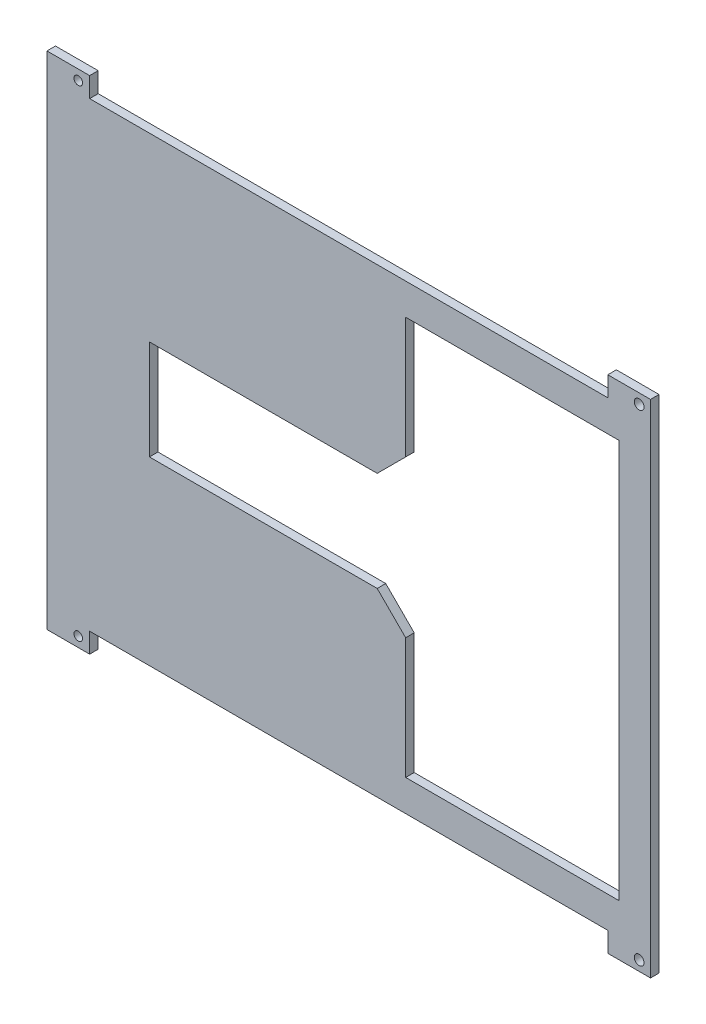
ISO-10303-21;
HEADER;
FILE_DESCRIPTION(('STEP AP214'),'2;1');
FILE_NAME('part.step','',(''),(''),'','','');
FILE_SCHEMA(('AUTOMOTIVE_DESIGN { 1 0 10303 214 1 1 1 1 }'));
ENDSEC;
DATA;
#1=APPLICATION_CONTEXT('core data for automotive mechanical design processes');
#2=APPLICATION_PROTOCOL_DEFINITION('international standard','automotive_design',2000,#1);
#3=PRODUCT_CONTEXT('',#1,'mechanical');
#4=PRODUCT('Part','Part','',(#3));
#5=PRODUCT_RELATED_PRODUCT_CATEGORY('part','',(#4));
#6=PRODUCT_DEFINITION_FORMATION('','',#4);
#7=PRODUCT_DEFINITION_CONTEXT('part definition',#1,'design');
#8=PRODUCT_DEFINITION('design','',#6,#7);
#9=PRODUCT_DEFINITION_SHAPE('','',#8);
#10=(LENGTH_UNIT() NAMED_UNIT(*) SI_UNIT(.MILLI.,.METRE.));
#11=(NAMED_UNIT(*) PLANE_ANGLE_UNIT() SI_UNIT($,.RADIAN.));
#12=(NAMED_UNIT(*) SI_UNIT($,.STERADIAN.) SOLID_ANGLE_UNIT());
#13=UNCERTAINTY_MEASURE_WITH_UNIT(LENGTH_MEASURE(1.E-05),#10,'distance_accuracy_value','');
#14=(GEOMETRIC_REPRESENTATION_CONTEXT(3) GLOBAL_UNCERTAINTY_ASSIGNED_CONTEXT((#13)) GLOBAL_UNIT_ASSIGNED_CONTEXT((#10,
#11,#12)) REPRESENTATION_CONTEXT('',''));
#15=CARTESIAN_POINT('',(0.,0.,0.));
#16=DIRECTION('',(0.,0.,1.));
#17=DIRECTION('',(1.,0.,0.));
#18=AXIS2_PLACEMENT_3D('',#15,#16,#17);
#19=CARTESIAN_POINT('',(0.,151.,3.));
#20=DIRECTION('',(0.,-1.,0.));
#21=DIRECTION('',(0.,0.,-1.));
#22=AXIS2_PLACEMENT_3D('',#19,#20,#21);
#23=PLANE('',#22);
#24=DIRECTION('',(-1.,0.,0.));
#25=VECTOR('',#24,1.);
#26=CARTESIAN_POINT('',(0.,151.,0.));
#27=LINE('',#26,#25);
#28=CARTESIAN_POINT('',(201.,151.,0.));
#29=VERTEX_POINT('',#28);
#30=CARTESIAN_POINT('',(126.,151.,0.));
#31=VERTEX_POINT('',#30);
#32=EDGE_CURVE('E307',#29,#31,#27,.T.);
#33=ORIENTED_EDGE('',*,*,#32,.F.);
#34=DIRECTION('',(0.,0.,-1.));
#35=VECTOR('',#34,1.);
#36=CARTESIAN_POINT('',(201.,151.,3.));
#37=LINE('',#36,#35);
#38=CARTESIAN_POINT('',(201.,151.,3.));
#39=VERTEX_POINT('',#38);
#40=EDGE_CURVE('E348',#39,#29,#37,.T.);
#41=ORIENTED_EDGE('',*,*,#40,.F.);
#42=DIRECTION('',(-1.,0.,0.));
#43=VECTOR('',#42,1.);
#44=CARTESIAN_POINT('',(0.,151.,3.));
#45=LINE('',#44,#43);
#46=CARTESIAN_POINT('',(126.,151.,3.));
#47=VERTEX_POINT('',#46);
#48=EDGE_CURVE('E243',#39,#47,#45,.T.);
#49=ORIENTED_EDGE('',*,*,#48,.T.);
#50=DIRECTION('',(0.,0.,-1.));
#51=VECTOR('',#50,1.);
#52=CARTESIAN_POINT('',(126.,151.,3.));
#53=LINE('',#52,#51);
#54=EDGE_CURVE('E202',#47,#31,#53,.T.);
#55=ORIENTED_EDGE('',*,*,#54,.T.);
#56=EDGE_LOOP('',(#33,#41,#49,#55));
#57=FACE_BOUND('',#56,.T.);
#58=ADVANCED_FACE('F41',(#57),#23,.T.);
#59=CARTESIAN_POINT('',(201.,0.,3.));
#60=DIRECTION('',(1.,0.,0.));
#61=DIRECTION('',(0.,0.,-1.));
#62=AXIS2_PLACEMENT_3D('',#59,#60,#61);
#63=PLANE('',#62);
#64=DIRECTION('',(0.,-1.,0.));
#65=VECTOR('',#64,1.);
#66=CARTESIAN_POINT('',(201.,0.,0.));
#67=LINE('',#66,#65);
#68=CARTESIAN_POINT('',(201.,11.,0.));
#69=VERTEX_POINT('',#68);
#70=EDGE_CURVE('E310',#29,#69,#67,.T.);
#71=ORIENTED_EDGE('',*,*,#70,.T.);
#72=DIRECTION('',(0.,0.,-1.));
#73=VECTOR('',#72,1.);
#74=CARTESIAN_POINT('',(201.,11.,3.));
#75=LINE('',#74,#73);
#76=CARTESIAN_POINT('',(201.,11.,3.));
#77=VERTEX_POINT('',#76);
#78=EDGE_CURVE('E346',#77,#69,#75,.T.);
#79=ORIENTED_EDGE('',*,*,#78,.F.);
#80=DIRECTION('',(0.,-1.,0.));
#81=VECTOR('',#80,1.);
#82=CARTESIAN_POINT('',(201.,0.,3.));
#83=LINE('',#82,#81);
#84=EDGE_CURVE('E246',#39,#77,#83,.T.);
#85=ORIENTED_EDGE('',*,*,#84,.F.);
#86=ORIENTED_EDGE('',*,*,#40,.T.);
#87=EDGE_LOOP('',(#71,#79,#85,#86));
#88=FACE_BOUND('',#87,.T.);
#89=ADVANCED_FACE('F427',(#88),#63,.F.);
#90=CARTESIAN_POINT('',(0.,11.,3.));
#91=DIRECTION('',(0.,1.,0.));
#92=DIRECTION('',(-1.,0.,0.));
#93=AXIS2_PLACEMENT_3D('',#90,#91,#92);
#94=PLANE('',#93);
#95=DIRECTION('',(1.,0.,0.));
#96=VECTOR('',#95,1.);
#97=CARTESIAN_POINT('',(0.,11.,0.));
#98=LINE('',#97,#96);
#99=CARTESIAN_POINT('',(126.,11.,0.));
#100=VERTEX_POINT('',#99);
#101=EDGE_CURVE('E313',#100,#69,#98,.T.);
#102=ORIENTED_EDGE('',*,*,#101,.F.);
#103=DIRECTION('',(0.,0.,-1.));
#104=VECTOR('',#103,1.);
#105=CARTESIAN_POINT('',(126.,11.,3.));
#106=LINE('',#105,#104);
#107=CARTESIAN_POINT('',(126.,11.,3.));
#108=VERTEX_POINT('',#107);
#109=EDGE_CURVE('E343',#108,#100,#106,.T.);
#110=ORIENTED_EDGE('',*,*,#109,.F.);
#111=DIRECTION('',(1.,0.,0.));
#112=VECTOR('',#111,1.);
#113=CARTESIAN_POINT('',(0.,11.,3.));
#114=LINE('',#113,#112);
#115=EDGE_CURVE('E248',#108,#77,#114,.T.);
#116=ORIENTED_EDGE('',*,*,#115,.T.);
#117=ORIENTED_EDGE('',*,*,#78,.T.);
#118=EDGE_LOOP('',(#102,#110,#116,#117));
#119=FACE_BOUND('',#118,.T.);
#120=ADVANCED_FACE('F432',(#119),#94,.T.);
#121=CARTESIAN_POINT('',(126.,0.,3.));
#122=DIRECTION('',(1.,0.,0.));
#123=DIRECTION('',(0.,0.,-1.));
#124=AXIS2_PLACEMENT_3D('',#121,#122,#123);
#125=PLANE('',#124);
#126=DIRECTION('',(0.,-1.,0.));
#127=VECTOR('',#126,1.);
#128=CARTESIAN_POINT('',(126.,0.,0.));
#129=LINE('',#128,#127);
#130=CARTESIAN_POINT('',(126.,53.4999999999999,0.));
#131=VERTEX_POINT('',#130);
#132=EDGE_CURVE('E316',#131,#100,#129,.T.);
#133=ORIENTED_EDGE('',*,*,#132,.F.);
#134=DIRECTION('',(0.,0.,1.));
#135=VECTOR('',#134,1.);
#136=CARTESIAN_POINT('',(126.,53.4999999999999,3.));
#137=LINE('',#136,#135);
#138=CARTESIAN_POINT('',(126.,53.4999999999999,3.));
#139=VERTEX_POINT('',#138);
#140=EDGE_CURVE('E379',#131,#139,#137,.T.);
#141=ORIENTED_EDGE('',*,*,#140,.T.);
#142=DIRECTION('',(0.,-1.,0.));
#143=VECTOR('',#142,1.);
#144=CARTESIAN_POINT('',(126.,0.,3.));
#145=LINE('',#144,#143);
#146=EDGE_CURVE('E251',#139,#108,#145,.T.);
#147=ORIENTED_EDGE('',*,*,#146,.T.);
#148=ORIENTED_EDGE('',*,*,#109,.T.);
#149=EDGE_LOOP('',(#133,#141,#147,#148));
#150=FACE_BOUND('',#149,.T.);
#151=ADVANCED_FACE('F502',(#150),#125,.T.);
#152=CARTESIAN_POINT('',(0.,63.5,3.));
#153=DIRECTION('',(0.,1.,0.));
#154=DIRECTION('',(-1.,0.,0.));
#155=AXIS2_PLACEMENT_3D('',#152,#153,#154);
#156=PLANE('',#155);
#157=DIRECTION('',(1.,0.,0.));
#158=VECTOR('',#157,1.);
#159=CARTESIAN_POINT('',(0.,63.5,3.));
#160=LINE('',#159,#158);
#161=CARTESIAN_POINT('',(36.,63.5,3.));
#162=VERTEX_POINT('',#161);
#163=CARTESIAN_POINT('',(116.,63.5,3.));
#164=VERTEX_POINT('',#163);
#165=EDGE_CURVE('E253',#162,#164,#160,.T.);
#166=ORIENTED_EDGE('',*,*,#165,.T.);
#167=DIRECTION('',(0.,0.,-1.));
#168=VECTOR('',#167,1.);
#169=CARTESIAN_POINT('',(116.,63.5,3.));
#170=LINE('',#169,#168);
#171=CARTESIAN_POINT('',(116.,63.5,0.));
#172=VERTEX_POINT('',#171);
#173=EDGE_CURVE('E350',#164,#172,#170,.T.);
#174=ORIENTED_EDGE('',*,*,#173,.T.);
#175=DIRECTION('',(1.,0.,0.));
#176=VECTOR('',#175,1.);
#177=CARTESIAN_POINT('',(0.,63.5,0.));
#178=LINE('',#177,#176);
#179=CARTESIAN_POINT('',(36.,63.5,0.));
#180=VERTEX_POINT('',#179);
#181=EDGE_CURVE('E318',#180,#172,#178,.T.);
#182=ORIENTED_EDGE('',*,*,#181,.F.);
#183=DIRECTION('',(0.,0.,-1.));
#184=VECTOR('',#183,1.);
#185=CARTESIAN_POINT('',(36.,63.5,3.));
#186=LINE('',#185,#184);
#187=EDGE_CURVE('E341',#162,#180,#186,.T.);
#188=ORIENTED_EDGE('',*,*,#187,.F.);
#189=EDGE_LOOP('',(#166,#174,#182,#188));
#190=FACE_BOUND('',#189,.T.);
#191=ADVANCED_FACE('F494',(#190),#156,.T.);
#192=CARTESIAN_POINT('',(36.,0.,3.));
#193=DIRECTION('',(1.,0.,0.));
#194=DIRECTION('',(0.,1.,0.));
#195=AXIS2_PLACEMENT_3D('',#192,#193,#194);
#196=PLANE('',#195);
#197=DIRECTION('',(0.,-1.,0.));
#198=VECTOR('',#197,1.);
#199=CARTESIAN_POINT('',(36.,0.,0.));
#200=LINE('',#199,#198);
#201=CARTESIAN_POINT('',(36.,98.5,0.));
#202=VERTEX_POINT('',#201);
#203=EDGE_CURVE('E321',#202,#180,#200,.T.);
#204=ORIENTED_EDGE('',*,*,#203,.F.);
#205=DIRECTION('',(0.,0.,-1.));
#206=VECTOR('',#205,1.);
#207=CARTESIAN_POINT('',(36.,98.5,3.));
#208=LINE('',#207,#206);
#209=CARTESIAN_POINT('',(36.,98.5,3.));
#210=VERTEX_POINT('',#209);
#211=EDGE_CURVE('E338',#210,#202,#208,.T.);
#212=ORIENTED_EDGE('',*,*,#211,.F.);
#213=DIRECTION('',(0.,-1.,0.));
#214=VECTOR('',#213,1.);
#215=CARTESIAN_POINT('',(36.,0.,3.));
#216=LINE('',#215,#214);
#217=EDGE_CURVE('E256',#210,#162,#216,.T.);
#218=ORIENTED_EDGE('',*,*,#217,.T.);
#219=ORIENTED_EDGE('',*,*,#187,.T.);
#220=EDGE_LOOP('',(#204,#212,#218,#219));
#221=FACE_BOUND('',#220,.T.);
#222=ADVANCED_FACE('F489',(#221),#196,.T.);
#223=CARTESIAN_POINT('',(0.,98.5,3.));
#224=DIRECTION('',(0.,-1.,0.));
#225=DIRECTION('',(1.,0.,0.));
#226=AXIS2_PLACEMENT_3D('',#223,#224,#225);
#227=PLANE('',#226);
#228=DIRECTION('',(-1.,0.,0.));
#229=VECTOR('',#228,1.);
#230=CARTESIAN_POINT('',(0.,98.5,0.));
#231=LINE('',#230,#229);
#232=CARTESIAN_POINT('',(116.,98.5,0.));
#233=VERTEX_POINT('',#232);
#234=EDGE_CURVE('E324',#233,#202,#231,.T.);
#235=ORIENTED_EDGE('',*,*,#234,.F.);
#236=DIRECTION('',(0.,0.,1.));
#237=VECTOR('',#236,1.);
#238=CARTESIAN_POINT('',(116.,98.5,3.));
#239=LINE('',#238,#237);
#240=CARTESIAN_POINT('',(116.,98.5,3.));
#241=VERTEX_POINT('',#240);
#242=EDGE_CURVE('E11',#233,#241,#239,.T.);
#243=ORIENTED_EDGE('',*,*,#242,.T.);
#244=DIRECTION('',(-1.,0.,0.));
#245=VECTOR('',#244,1.);
#246=CARTESIAN_POINT('',(0.,98.5,3.));
#247=LINE('',#246,#245);
#248=EDGE_CURVE('E259',#241,#210,#247,.T.);
#249=ORIENTED_EDGE('',*,*,#248,.T.);
#250=ORIENTED_EDGE('',*,*,#211,.T.);
#251=EDGE_LOOP('',(#235,#243,#249,#250));
#252=FACE_BOUND('',#251,.T.);
#253=ADVANCED_FACE('F480',(#252),#227,.T.);
#254=CARTESIAN_POINT('',(0.,0.,3.));
#255=DIRECTION('',(-1.,0.,0.));
#256=DIRECTION('',(0.,0.,1.));
#257=AXIS2_PLACEMENT_3D('',#254,#255,#256);
#258=PLANE('',#257);
#259=DIRECTION('',(0.,1.,0.));
#260=VECTOR('',#259,1.);
#261=CARTESIAN_POINT('',(0.,0.,0.));
#262=LINE('',#261,#260);
#263=CARTESIAN_POINT('',(0.,-7.00000000000001,0.));
#264=VERTEX_POINT('',#263);
#265=CARTESIAN_POINT('',(0.,169.,0.));
#266=VERTEX_POINT('',#265);
#267=EDGE_CURVE('E198',#264,#266,#262,.T.);
#268=ORIENTED_EDGE('',*,*,#267,.F.);
#269=DIRECTION('',(0.,0.,-1.));
#270=VECTOR('',#269,1.);
#271=CARTESIAN_POINT('',(0.,-7.00000000000001,3.));
#272=LINE('',#271,#270);
#273=CARTESIAN_POINT('',(0.,-7.00000000000001,3.));
#274=VERTEX_POINT('',#273);
#275=EDGE_CURVE('E191',#274,#264,#272,.T.);
#276=ORIENTED_EDGE('',*,*,#275,.F.);
#277=DIRECTION('',(0.,1.,0.));
#278=VECTOR('',#277,1.);
#279=CARTESIAN_POINT('',(0.,0.,3.));
#280=LINE('',#279,#278);
#281=CARTESIAN_POINT('',(0.,169.,3.));
#282=VERTEX_POINT('',#281);
#283=EDGE_CURVE('E195',#274,#282,#280,.T.);
#284=ORIENTED_EDGE('',*,*,#283,.T.);
#285=DIRECTION('',(0.,0.,-1.));
#286=VECTOR('',#285,1.);
#287=CARTESIAN_POINT('',(0.,169.,3.));
#288=LINE('',#287,#286);
#289=EDGE_CURVE('E275',#282,#266,#288,.T.);
#290=ORIENTED_EDGE('',*,*,#289,.T.);
#291=EDGE_LOOP('',(#268,#276,#284,#290));
#292=FACE_BOUND('',#291,.T.);
#293=ADVANCED_FACE('F193',(#292),#258,.T.);
#294=CARTESIAN_POINT('',(0.,-7.00000000000001,3.));
#295=DIRECTION('',(0.,1.,0.));
#296=DIRECTION('',(0.,0.,1.));
#297=AXIS2_PLACEMENT_3D('',#294,#295,#296);
#298=PLANE('',#297);
#299=DIRECTION('',(1.,0.,0.));
#300=VECTOR('',#299,1.);
#301=CARTESIAN_POINT('',(0.,-7.00000000000001,0.));
#302=LINE('',#301,#300);
#303=CARTESIAN_POINT('',(15.,-7.00000000000001,0.));
#304=VERTEX_POINT('',#303);
#305=EDGE_CURVE('E277',#264,#304,#302,.T.);
#306=ORIENTED_EDGE('',*,*,#305,.T.);
#307=DIRECTION('',(0.,0.,-1.));
#308=VECTOR('',#307,1.);
#309=CARTESIAN_POINT('',(15.,-7.00000000000001,3.));
#310=LINE('',#309,#308);
#311=CARTESIAN_POINT('',(15.,-7.00000000000001,3.));
#312=VERTEX_POINT('',#311);
#313=EDGE_CURVE('E203',#312,#304,#310,.T.);
#314=ORIENTED_EDGE('',*,*,#313,.F.);
#315=DIRECTION('',(1.,0.,0.));
#316=VECTOR('',#315,1.);
#317=CARTESIAN_POINT('',(0.,-7.00000000000001,3.));
#318=LINE('',#317,#316);
#319=EDGE_CURVE('E206',#274,#312,#318,.T.);
#320=ORIENTED_EDGE('',*,*,#319,.F.);
#321=ORIENTED_EDGE('',*,*,#275,.T.);
#322=EDGE_LOOP('',(#306,#314,#320,#321));
#323=FACE_BOUND('',#322,.T.);
#324=ADVANCED_FACE('F207',(#323),#298,.F.);
#325=CARTESIAN_POINT('',(15.,0.,3.));
#326=DIRECTION('',(1.,0.,0.));
#327=DIRECTION('',(0.,0.,-1.));
#328=AXIS2_PLACEMENT_3D('',#325,#326,#327);
#329=PLANE('',#328);
#330=DIRECTION('',(0.,-1.,0.));
#331=VECTOR('',#330,1.);
#332=CARTESIAN_POINT('',(15.,0.,0.));
#333=LINE('',#332,#331);
#334=CARTESIAN_POINT('',(15.,0.,0.));
#335=VERTEX_POINT('',#334);
#336=EDGE_CURVE('E279',#335,#304,#333,.T.);
#337=ORIENTED_EDGE('',*,*,#336,.F.);
#338=DIRECTION('',(0.,0.,-1.));
#339=VECTOR('',#338,1.);
#340=CARTESIAN_POINT('',(15.,0.,3.));
#341=LINE('',#340,#339);
#342=CARTESIAN_POINT('',(15.,0.,3.));
#343=VERTEX_POINT('',#342);
#344=EDGE_CURVE('E370',#343,#335,#341,.T.);
#345=ORIENTED_EDGE('',*,*,#344,.F.);
#346=DIRECTION('',(0.,-1.,0.));
#347=VECTOR('',#346,1.);
#348=CARTESIAN_POINT('',(15.,0.,3.));
#349=LINE('',#348,#347);
#350=EDGE_CURVE('E211',#343,#312,#349,.T.);
#351=ORIENTED_EDGE('',*,*,#350,.T.);
#352=ORIENTED_EDGE('',*,*,#313,.T.);
#353=EDGE_LOOP('',(#337,#345,#351,#352));
#354=FACE_BOUND('',#353,.T.);
#355=ADVANCED_FACE('F472',(#354),#329,.T.);
#356=CARTESIAN_POINT('',(0.,0.,3.));
#357=DIRECTION('',(0.,1.,0.));
#358=DIRECTION('',(0.,0.,1.));
#359=AXIS2_PLACEMENT_3D('',#356,#357,#358);
#360=PLANE('',#359);
#361=DIRECTION('',(1.,0.,0.));
#362=VECTOR('',#361,1.);
#363=CARTESIAN_POINT('',(0.,0.,0.));
#364=LINE('',#363,#362);
#365=CARTESIAN_POINT('',(197.,0.,0.));
#366=VERTEX_POINT('',#365);
#367=EDGE_CURVE('E282',#335,#366,#364,.T.);
#368=ORIENTED_EDGE('',*,*,#367,.T.);
#369=DIRECTION('',(0.,0.,-1.));
#370=VECTOR('',#369,1.);
#371=CARTESIAN_POINT('',(197.,0.,3.));
#372=LINE('',#371,#370);
#373=CARTESIAN_POINT('',(197.,0.,3.));
#374=VERTEX_POINT('',#373);
#375=EDGE_CURVE('E367',#374,#366,#372,.T.);
#376=ORIENTED_EDGE('',*,*,#375,.F.);
#377=DIRECTION('',(1.,0.,0.));
#378=VECTOR('',#377,1.);
#379=CARTESIAN_POINT('',(0.,0.,3.));
#380=LINE('',#379,#378);
#381=EDGE_CURVE('E223',#343,#374,#380,.T.);
#382=ORIENTED_EDGE('',*,*,#381,.F.);
#383=ORIENTED_EDGE('',*,*,#344,.T.);
#384=EDGE_LOOP('',(#368,#376,#382,#383));
#385=FACE_BOUND('',#384,.T.);
#386=ADVANCED_FACE('F468',(#385),#360,.F.);
#387=CARTESIAN_POINT('',(197.,0.,3.));
#388=DIRECTION('',(1.,0.,0.));
#389=DIRECTION('',(0.,0.,-1.));
#390=AXIS2_PLACEMENT_3D('',#387,#388,#389);
#391=PLANE('',#390);
#392=DIRECTION('',(0.,-1.,0.));
#393=VECTOR('',#392,1.);
#394=CARTESIAN_POINT('',(197.,0.,0.));
#395=LINE('',#394,#393);
#396=CARTESIAN_POINT('',(197.,-7.,0.));
#397=VERTEX_POINT('',#396);
#398=EDGE_CURVE('E284',#366,#397,#395,.T.);
#399=ORIENTED_EDGE('',*,*,#398,.T.);
#400=DIRECTION('',(0.,0.,-1.));
#401=VECTOR('',#400,1.);
#402=CARTESIAN_POINT('',(197.,-7.,3.));
#403=LINE('',#402,#401);
#404=CARTESIAN_POINT('',(197.,-7.,3.));
#405=VERTEX_POINT('',#404);
#406=EDGE_CURVE('E365',#405,#397,#403,.T.);
#407=ORIENTED_EDGE('',*,*,#406,.F.);
#408=DIRECTION('',(0.,-1.,0.));
#409=VECTOR('',#408,1.);
#410=CARTESIAN_POINT('',(197.,0.,3.));
#411=LINE('',#410,#409);
#412=EDGE_CURVE('E225',#374,#405,#411,.T.);
#413=ORIENTED_EDGE('',*,*,#412,.F.);
#414=ORIENTED_EDGE('',*,*,#375,.T.);
#415=EDGE_LOOP('',(#399,#407,#413,#414));
#416=FACE_BOUND('',#415,.T.);
#417=ADVANCED_FACE('F464',(#416),#391,.F.);
#418=CARTESIAN_POINT('',(0.,-7.00000000000002,3.));
#419=DIRECTION('',(0.,-1.,0.));
#420=DIRECTION('',(1.,0.,0.));
#421=AXIS2_PLACEMENT_3D('',#418,#419,#420);
#422=PLANE('',#421);
#423=DIRECTION('',(-1.,0.,0.));
#424=VECTOR('',#423,1.);
#425=CARTESIAN_POINT('',(0.,-7.00000000000002,0.));
#426=LINE('',#425,#424);
#427=CARTESIAN_POINT('',(212.,-7.,0.));
#428=VERTEX_POINT('',#427);
#429=EDGE_CURVE('E287',#428,#397,#426,.T.);
#430=ORIENTED_EDGE('',*,*,#429,.F.);
#431=DIRECTION('',(0.,0.,-1.));
#432=VECTOR('',#431,1.);
#433=CARTESIAN_POINT('',(212.,-7.,3.));
#434=LINE('',#433,#432);
#435=CARTESIAN_POINT('',(212.,-7.,3.));
#436=VERTEX_POINT('',#435);
#437=EDGE_CURVE('E363',#436,#428,#434,.T.);
#438=ORIENTED_EDGE('',*,*,#437,.F.);
#439=DIRECTION('',(-1.,0.,0.));
#440=VECTOR('',#439,1.);
#441=CARTESIAN_POINT('',(0.,-7.00000000000002,3.));
#442=LINE('',#441,#440);
#443=EDGE_CURVE('E227',#436,#405,#442,.T.);
#444=ORIENTED_EDGE('',*,*,#443,.T.);
#445=ORIENTED_EDGE('',*,*,#406,.T.);
#446=EDGE_LOOP('',(#430,#438,#444,#445));
#447=FACE_BOUND('',#446,.T.);
#448=ADVANCED_FACE('F460',(#447),#422,.T.);
#449=CARTESIAN_POINT('',(212.,0.,3.));
#450=DIRECTION('',(-1.,0.,0.));
#451=DIRECTION('',(0.,0.,1.));
#452=AXIS2_PLACEMENT_3D('',#449,#450,#451);
#453=PLANE('',#452);
#454=DIRECTION('',(0.,1.,0.));
#455=VECTOR('',#454,1.);
#456=CARTESIAN_POINT('',(212.,0.,0.));
#457=LINE('',#456,#455);
#458=CARTESIAN_POINT('',(212.,169.,0.));
#459=VERTEX_POINT('',#458);
#460=EDGE_CURVE('E290',#428,#459,#457,.T.);
#461=ORIENTED_EDGE('',*,*,#460,.T.);
#462=DIRECTION('',(0.,0.,-1.));
#463=VECTOR('',#462,1.);
#464=CARTESIAN_POINT('',(212.,169.,3.));
#465=LINE('',#464,#463);
#466=CARTESIAN_POINT('',(212.,169.,3.));
#467=VERTEX_POINT('',#466);
#468=EDGE_CURVE('E360',#467,#459,#465,.T.);
#469=ORIENTED_EDGE('',*,*,#468,.F.);
#470=DIRECTION('',(0.,1.,0.));
#471=VECTOR('',#470,1.);
#472=CARTESIAN_POINT('',(212.,0.,3.));
#473=LINE('',#472,#471);
#474=EDGE_CURVE('E230',#436,#467,#473,.T.);
#475=ORIENTED_EDGE('',*,*,#474,.F.);
#476=ORIENTED_EDGE('',*,*,#437,.T.);
#477=EDGE_LOOP('',(#461,#469,#475,#476));
#478=FACE_BOUND('',#477,.T.);
#479=ADVANCED_FACE('F456',(#478),#453,.F.);
#480=CARTESIAN_POINT('',(3.12712818602753E-13,169.,3.));
#481=DIRECTION('',(0.,-1.,0.));
#482=DIRECTION('',(1.,0.,0.));
#483=AXIS2_PLACEMENT_3D('',#480,#481,#482);
#484=PLANE('',#483);
#485=DIRECTION('',(-1.,0.,0.));
#486=VECTOR('',#485,1.);
#487=CARTESIAN_POINT('',(3.12712818602753E-13,169.,0.));
#488=LINE('',#487,#486);
#489=CARTESIAN_POINT('',(197.,169.,0.));
#490=VERTEX_POINT('',#489);
#491=EDGE_CURVE('E292',#459,#490,#488,.T.);
#492=ORIENTED_EDGE('',*,*,#491,.T.);
#493=DIRECTION('',(0.,0.,-1.));
#494=VECTOR('',#493,1.);
#495=CARTESIAN_POINT('',(197.,169.,3.));
#496=LINE('',#495,#494);
#497=CARTESIAN_POINT('',(197.,169.,3.));
#498=VERTEX_POINT('',#497);
#499=EDGE_CURVE('E358',#498,#490,#496,.T.);
#500=ORIENTED_EDGE('',*,*,#499,.F.);
#501=DIRECTION('',(-1.,0.,0.));
#502=VECTOR('',#501,1.);
#503=CARTESIAN_POINT('',(3.12712818602753E-13,169.,3.));
#504=LINE('',#503,#502);
#505=EDGE_CURVE('E232',#467,#498,#504,.T.);
#506=ORIENTED_EDGE('',*,*,#505,.F.);
#507=ORIENTED_EDGE('',*,*,#468,.T.);
#508=EDGE_LOOP('',(#492,#500,#506,#507));
#509=FACE_BOUND('',#508,.T.);
#510=ADVANCED_FACE('F452',(#509),#484,.F.);
#511=CARTESIAN_POINT('',(197.,0.,3.));
#512=DIRECTION('',(-1.,0.,0.));
#513=DIRECTION('',(0.,0.,1.));
#514=AXIS2_PLACEMENT_3D('',#511,#512,#513);
#515=PLANE('',#514);
#516=DIRECTION('',(0.,1.,0.));
#517=VECTOR('',#516,1.);
#518=CARTESIAN_POINT('',(197.,0.,0.));
#519=LINE('',#518,#517);
#520=CARTESIAN_POINT('',(197.,162.,0.));
#521=VERTEX_POINT('',#520);
#522=EDGE_CURVE('E295',#521,#490,#519,.T.);
#523=ORIENTED_EDGE('',*,*,#522,.F.);
#524=DIRECTION('',(0.,0.,-1.));
#525=VECTOR('',#524,1.);
#526=CARTESIAN_POINT('',(197.,162.,3.));
#527=LINE('',#526,#525);
#528=CARTESIAN_POINT('',(197.,162.,3.));
#529=VERTEX_POINT('',#528);
#530=EDGE_CURVE('E356',#529,#521,#527,.T.);
#531=ORIENTED_EDGE('',*,*,#530,.F.);
#532=DIRECTION('',(0.,1.,0.));
#533=VECTOR('',#532,1.);
#534=CARTESIAN_POINT('',(197.,0.,3.));
#535=LINE('',#534,#533);
#536=EDGE_CURVE('E234',#529,#498,#535,.T.);
#537=ORIENTED_EDGE('',*,*,#536,.T.);
#538=ORIENTED_EDGE('',*,*,#499,.T.);
#539=EDGE_LOOP('',(#523,#531,#537,#538));
#540=FACE_BOUND('',#539,.T.);
#541=ADVANCED_FACE('F448',(#540),#515,.T.);
#542=CARTESIAN_POINT('',(0.,162.,3.));
#543=DIRECTION('',(0.,1.,0.));
#544=DIRECTION('',(0.,0.,1.));
#545=AXIS2_PLACEMENT_3D('',#542,#543,#544);
#546=PLANE('',#545);
#547=DIRECTION('',(1.,0.,0.));
#548=VECTOR('',#547,1.);
#549=CARTESIAN_POINT('',(0.,162.,0.));
#550=LINE('',#549,#548);
#551=CARTESIAN_POINT('',(15.,162.,0.));
#552=VERTEX_POINT('',#551);
#553=EDGE_CURVE('E298',#552,#521,#550,.T.);
#554=ORIENTED_EDGE('',*,*,#553,.F.);
#555=DIRECTION('',(0.,0.,-1.));
#556=VECTOR('',#555,1.);
#557=CARTESIAN_POINT('',(15.,162.,3.));
#558=LINE('',#557,#556);
#559=CARTESIAN_POINT('',(15.,162.,3.));
#560=VERTEX_POINT('',#559);
#561=EDGE_CURVE('E354',#560,#552,#558,.T.);
#562=ORIENTED_EDGE('',*,*,#561,.F.);
#563=DIRECTION('',(1.,0.,0.));
#564=VECTOR('',#563,1.);
#565=CARTESIAN_POINT('',(0.,162.,3.));
#566=LINE('',#565,#564);
#567=EDGE_CURVE('E237',#560,#529,#566,.T.);
#568=ORIENTED_EDGE('',*,*,#567,.T.);
#569=ORIENTED_EDGE('',*,*,#530,.T.);
#570=EDGE_LOOP('',(#554,#562,#568,#569));
#571=FACE_BOUND('',#570,.T.);
#572=ADVANCED_FACE('F444',(#571),#546,.T.);
#573=CARTESIAN_POINT('',(15.,0.,3.));
#574=DIRECTION('',(-1.,0.,0.));
#575=DIRECTION('',(0.,0.,1.));
#576=AXIS2_PLACEMENT_3D('',#573,#574,#575);
#577=PLANE('',#576);
#578=DIRECTION('',(0.,1.,0.));
#579=VECTOR('',#578,1.);
#580=CARTESIAN_POINT('',(15.,0.,0.));
#581=LINE('',#580,#579);
#582=CARTESIAN_POINT('',(15.,169.,0.));
#583=VERTEX_POINT('',#582);
#584=EDGE_CURVE('E301',#552,#583,#581,.T.);
#585=ORIENTED_EDGE('',*,*,#584,.T.);
#586=DIRECTION('',(0.,0.,-1.));
#587=VECTOR('',#586,1.);
#588=CARTESIAN_POINT('',(15.,169.,3.));
#589=LINE('',#588,#587);
#590=CARTESIAN_POINT('',(15.,169.,3.));
#591=VERTEX_POINT('',#590);
#592=EDGE_CURVE('E352',#591,#583,#589,.T.);
#593=ORIENTED_EDGE('',*,*,#592,.F.);
#594=DIRECTION('',(0.,1.,0.));
#595=VECTOR('',#594,1.);
#596=CARTESIAN_POINT('',(15.,0.,3.));
#597=LINE('',#596,#595);
#598=EDGE_CURVE('E240',#560,#591,#597,.T.);
#599=ORIENTED_EDGE('',*,*,#598,.F.);
#600=ORIENTED_EDGE('',*,*,#561,.T.);
#601=EDGE_LOOP('',(#585,#593,#599,#600));
#602=FACE_BOUND('',#601,.T.);
#603=ADVANCED_FACE('F440',(#602),#577,.F.);
#604=CARTESIAN_POINT('',(208.,-3.49999999999998,3.));
#605=DIRECTION('',(0.,0.,-1.));
#606=DIRECTION('',(-1.,0.,0.));
#607=AXIS2_PLACEMENT_3D('',#604,#605,#606);
#608=CYLINDRICAL_SURFACE('',#607,1.71557233530482);
#609=CARTESIAN_POINT('',(208.,-3.49999999999998,3.));
#610=DIRECTION('',(0.,0.,1.));
#611=DIRECTION('',(1.,0.,0.));
#612=AXIS2_PLACEMENT_3D('',#609,#610,#611);
#613=CIRCLE('',#612,1.71557233530482);
#614=CARTESIAN_POINT('',(209.715572335305,-3.49999999999998,3.));
#615=VERTEX_POINT('',#614);
#616=EDGE_CURVE('E269',#615,#615,#613,.F.);
#617=ORIENTED_EDGE('',*,*,#616,.F.);
#618=EDGE_LOOP('',(#617));
#619=FACE_BOUND('',#618,.T.);
#620=CARTESIAN_POINT('',(208.,-3.49999999999998,0.));
#621=DIRECTION('',(0.,0.,1.));
#622=DIRECTION('',(1.,0.,0.));
#623=AXIS2_PLACEMENT_3D('',#620,#621,#622);
#624=CIRCLE('',#623,1.71557233530482);
#625=CARTESIAN_POINT('',(209.715572335305,-3.49999999999998,0.));
#626=VERTEX_POINT('',#625);
#627=EDGE_CURVE('E219',#626,#626,#624,.F.);
#628=ORIENTED_EDGE('',*,*,#627,.T.);
#629=EDGE_LOOP('',(#628));
#630=FACE_BOUND('',#629,.T.);
#631=ADVANCED_FACE('F443',(#619,#630),#608,.F.);
#632=CARTESIAN_POINT('',(11.,165.5,3.));
#633=DIRECTION('',(0.,0.,-1.));
#634=DIRECTION('',(-1.,0.,0.));
#635=AXIS2_PLACEMENT_3D('',#632,#633,#634);
#636=CYLINDRICAL_SURFACE('',#635,1.5);
#637=CARTESIAN_POINT('',(11.,165.5,3.));
#638=DIRECTION('',(0.,0.,1.));
#639=DIRECTION('',(1.,0.,0.));
#640=AXIS2_PLACEMENT_3D('',#637,#638,#639);
#641=CIRCLE('',#640,1.5);
#642=CARTESIAN_POINT('',(12.5,165.5,3.));
#643=VERTEX_POINT('',#642);
#644=EDGE_CURVE('E266',#643,#643,#641,.T.);
#645=ORIENTED_EDGE('',*,*,#644,.T.);
#646=EDGE_LOOP('',(#645));
#647=FACE_BOUND('',#646,.T.);
#648=CARTESIAN_POINT('',(11.,165.5,0.));
#649=DIRECTION('',(0.,0.,1.));
#650=DIRECTION('',(1.,0.,0.));
#651=AXIS2_PLACEMENT_3D('',#648,#649,#650);
#652=CIRCLE('',#651,1.5);
#653=CARTESIAN_POINT('',(12.5,165.5,0.));
#654=VERTEX_POINT('',#653);
#655=EDGE_CURVE('E332',#654,#654,#652,.T.);
#656=ORIENTED_EDGE('',*,*,#655,.F.);
#657=EDGE_LOOP('',(#656));
#658=FACE_BOUND('',#657,.T.);
#659=ADVANCED_FACE('F597',(#647,#658),#636,.F.);
#660=CARTESIAN_POINT('',(208.,165.5,3.));
#661=DIRECTION('',(0.,0.,-1.));
#662=DIRECTION('',(-1.,0.,0.));
#663=AXIS2_PLACEMENT_3D('',#660,#661,#662);
#664=CYLINDRICAL_SURFACE('',#663,1.71557233530483);
#665=CARTESIAN_POINT('',(208.,165.5,3.));
#666=DIRECTION('',(0.,0.,1.));
#667=DIRECTION('',(1.,0.,0.));
#668=AXIS2_PLACEMENT_3D('',#665,#666,#667);
#669=CIRCLE('',#668,1.71557233530483);
#670=CARTESIAN_POINT('',(209.715572335305,165.5,3.));
#671=VERTEX_POINT('',#670);
#672=EDGE_CURVE('E263',#671,#671,#669,.T.);
#673=ORIENTED_EDGE('',*,*,#672,.T.);
#674=EDGE_LOOP('',(#673));
#675=FACE_BOUND('',#674,.T.);
#676=CARTESIAN_POINT('',(208.,165.5,0.));
#677=DIRECTION('',(0.,0.,1.));
#678=DIRECTION('',(1.,0.,0.));
#679=AXIS2_PLACEMENT_3D('',#676,#677,#678);
#680=CIRCLE('',#679,1.71557233530483);
#681=CARTESIAN_POINT('',(209.715572335305,165.5,0.));
#682=VERTEX_POINT('',#681);
#683=EDGE_CURVE('E329',#682,#682,#680,.T.);
#684=ORIENTED_EDGE('',*,*,#683,.F.);
#685=EDGE_LOOP('',(#684));
#686=FACE_BOUND('',#685,.T.);
#687=ADVANCED_FACE('F550',(#675,#686),#664,.F.);
#688=CARTESIAN_POINT('',(126.,0.,3.));
#689=DIRECTION('',(1.,0.,0.));
#690=DIRECTION('',(0.,0.,-1.));
#691=AXIS2_PLACEMENT_3D('',#688,#689,#690);
#692=PLANE('',#691);
#693=DIRECTION('',(0.,-1.,0.));
#694=VECTOR('',#693,1.);
#695=CARTESIAN_POINT('',(126.,0.,3.));
#696=LINE('',#695,#694);
#697=CARTESIAN_POINT('',(126.,108.5,3.));
#698=VERTEX_POINT('',#697);
#699=EDGE_CURVE('E261',#47,#698,#696,.T.);
#700=ORIENTED_EDGE('',*,*,#699,.T.);
#701=DIRECTION('',(0.,0.,-1.));
#702=VECTOR('',#701,1.);
#703=CARTESIAN_POINT('',(126.,108.5,3.));
#704=LINE('',#703,#702);
#705=CARTESIAN_POINT('',(126.,108.5,0.));
#706=VERTEX_POINT('',#705);
#707=EDGE_CURVE('E50',#698,#706,#704,.T.);
#708=ORIENTED_EDGE('',*,*,#707,.T.);
#709=DIRECTION('',(0.,-1.,0.));
#710=VECTOR('',#709,1.);
#711=CARTESIAN_POINT('',(126.,0.,0.));
#712=LINE('',#711,#710);
#713=EDGE_CURVE('E326',#31,#706,#712,.T.);
#714=ORIENTED_EDGE('',*,*,#713,.F.);
#715=ORIENTED_EDGE('',*,*,#54,.F.);
#716=EDGE_LOOP('',(#700,#708,#714,#715));
#717=FACE_BOUND('',#716,.T.);
#718=ADVANCED_FACE('F387',(#717),#692,.T.);
#719=CARTESIAN_POINT('',(0.,169.,3.));
#720=DIRECTION('',(0.,1.,0.));
#721=DIRECTION('',(0.,0.,1.));
#722=AXIS2_PLACEMENT_3D('',#719,#720,#721);
#723=PLANE('',#722);
#724=DIRECTION('',(1.,0.,0.));
#725=VECTOR('',#724,1.);
#726=CARTESIAN_POINT('',(0.,169.,0.));
#727=LINE('',#726,#725);
#728=EDGE_CURVE('E304',#266,#583,#727,.T.);
#729=ORIENTED_EDGE('',*,*,#728,.F.);
#730=ORIENTED_EDGE('',*,*,#289,.F.);
#731=DIRECTION('',(1.,0.,0.));
#732=VECTOR('',#731,1.);
#733=CARTESIAN_POINT('',(0.,169.,3.));
#734=LINE('',#733,#732);
#735=EDGE_CURVE('E215',#282,#591,#734,.T.);
#736=ORIENTED_EDGE('',*,*,#735,.T.);
#737=ORIENTED_EDGE('',*,*,#592,.T.);
#738=EDGE_LOOP('',(#729,#730,#736,#737));
#739=FACE_BOUND('',#738,.T.);
#740=ADVANCED_FACE('F414',(#739),#723,.T.);
#741=CARTESIAN_POINT('',(11.,-3.5,3.));
#742=DIRECTION('',(0.,0.,-1.));
#743=DIRECTION('',(-1.,0.,0.));
#744=AXIS2_PLACEMENT_3D('',#741,#742,#743);
#745=CYLINDRICAL_SURFACE('',#744,1.5);
#746=CARTESIAN_POINT('',(11.,-3.5,3.));
#747=DIRECTION('',(0.,0.,1.));
#748=DIRECTION('',(1.,0.,0.));
#749=AXIS2_PLACEMENT_3D('',#746,#747,#748);
#750=CIRCLE('',#749,1.5);
#751=CARTESIAN_POINT('',(12.5,-3.5,3.));
#752=VERTEX_POINT('',#751);
#753=EDGE_CURVE('E272',#752,#752,#750,.F.);
#754=ORIENTED_EDGE('',*,*,#753,.F.);
#755=EDGE_LOOP('',(#754));
#756=FACE_BOUND('',#755,.T.);
#757=CARTESIAN_POINT('',(11.,-3.5,0.));
#758=DIRECTION('',(0.,0.,1.));
#759=DIRECTION('',(1.,0.,0.));
#760=AXIS2_PLACEMENT_3D('',#757,#758,#759);
#761=CIRCLE('',#760,1.5);
#762=CARTESIAN_POINT('',(12.5,-3.5,0.));
#763=VERTEX_POINT('',#762);
#764=EDGE_CURVE('E216',#763,#763,#761,.F.);
#765=ORIENTED_EDGE('',*,*,#764,.T.);
#766=EDGE_LOOP('',(#765));
#767=FACE_BOUND('',#766,.T.);
#768=ADVANCED_FACE('F402',(#756,#767),#745,.F.);
#769=CARTESIAN_POINT('',(0.,0.,3.));
#770=DIRECTION('',(0.,0.,1.));
#771=DIRECTION('',(1.,0.,0.));
#772=AXIS2_PLACEMENT_3D('',#769,#770,#771);
#773=PLANE('',#772);
#774=ORIENTED_EDGE('',*,*,#283,.F.);
#775=ORIENTED_EDGE('',*,*,#319,.T.);
#776=ORIENTED_EDGE('',*,*,#350,.F.);
#777=ORIENTED_EDGE('',*,*,#381,.T.);
#778=ORIENTED_EDGE('',*,*,#412,.T.);
#779=ORIENTED_EDGE('',*,*,#443,.F.);
#780=ORIENTED_EDGE('',*,*,#474,.T.);
#781=ORIENTED_EDGE('',*,*,#505,.T.);
#782=ORIENTED_EDGE('',*,*,#536,.F.);
#783=ORIENTED_EDGE('',*,*,#567,.F.);
#784=ORIENTED_EDGE('',*,*,#598,.T.);
#785=ORIENTED_EDGE('',*,*,#735,.F.);
#786=EDGE_LOOP('',(#774,#775,#776,#777,#778,#779,#780,#781,#782,#783,#784,#785));
#787=FACE_BOUND('',#786,.T.);
#788=ORIENTED_EDGE('',*,*,#146,.F.);
#789=DIRECTION('',(0.707106781186547,-0.707106781186548,0.));
#790=VECTOR('',#789,1.);
#791=CARTESIAN_POINT('',(89.7500000000001,89.7499999999999,3.));
#792=LINE('',#791,#790);
#793=EDGE_CURVE('E382',#139,#164,#792,.F.);
#794=ORIENTED_EDGE('',*,*,#793,.T.);
#795=ORIENTED_EDGE('',*,*,#165,.F.);
#796=ORIENTED_EDGE('',*,*,#217,.F.);
#797=ORIENTED_EDGE('',*,*,#248,.F.);
#798=DIRECTION('',(-0.70710678118655,-0.707106781186545,0.));
#799=VECTOR('',#798,1.);
#800=CARTESIAN_POINT('',(8.74999999999957,-8.74999999999963,3.));
#801=LINE('',#800,#799);
#802=EDGE_CURVE('E57',#241,#698,#801,.F.);
#803=ORIENTED_EDGE('',*,*,#802,.T.);
#804=ORIENTED_EDGE('',*,*,#699,.F.);
#805=ORIENTED_EDGE('',*,*,#48,.F.);
#806=ORIENTED_EDGE('',*,*,#84,.T.);
#807=ORIENTED_EDGE('',*,*,#115,.F.);
#808=EDGE_LOOP('',(#788,#794,#795,#796,#797,#803,#804,#805,#806,#807));
#809=FACE_BOUND('',#808,.T.);
#810=ORIENTED_EDGE('',*,*,#672,.F.);
#811=EDGE_LOOP('',(#810));
#812=FACE_BOUND('',#811,.T.);
#813=ORIENTED_EDGE('',*,*,#644,.F.);
#814=EDGE_LOOP('',(#813));
#815=FACE_BOUND('',#814,.T.);
#816=ORIENTED_EDGE('',*,*,#616,.T.);
#817=EDGE_LOOP('',(#816));
#818=FACE_BOUND('',#817,.T.);
#819=ORIENTED_EDGE('',*,*,#753,.T.);
#820=EDGE_LOOP('',(#819));
#821=FACE_BOUND('',#820,.T.);
#822=ADVANCED_FACE('F213',(#787,#809,#812,#815,#818,#821),#773,.T.);
#823=CARTESIAN_POINT('',(0.,0.,0.));
#824=DIRECTION('',(0.,0.,1.));
#825=DIRECTION('',(1.,0.,0.));
#826=AXIS2_PLACEMENT_3D('',#823,#824,#825);
#827=PLANE('',#826);
#828=ORIENTED_EDGE('',*,*,#267,.T.);
#829=ORIENTED_EDGE('',*,*,#728,.T.);
#830=ORIENTED_EDGE('',*,*,#584,.F.);
#831=ORIENTED_EDGE('',*,*,#553,.T.);
#832=ORIENTED_EDGE('',*,*,#522,.T.);
#833=ORIENTED_EDGE('',*,*,#491,.F.);
#834=ORIENTED_EDGE('',*,*,#460,.F.);
#835=ORIENTED_EDGE('',*,*,#429,.T.);
#836=ORIENTED_EDGE('',*,*,#398,.F.);
#837=ORIENTED_EDGE('',*,*,#367,.F.);
#838=ORIENTED_EDGE('',*,*,#336,.T.);
#839=ORIENTED_EDGE('',*,*,#305,.F.);
#840=EDGE_LOOP('',(#828,#829,#830,#831,#832,#833,#834,#835,#836,#837,#838,#839));
#841=FACE_BOUND('',#840,.T.);
#842=ORIENTED_EDGE('',*,*,#181,.T.);
#843=DIRECTION('',(-0.707106781186547,0.707106781186548,0.));
#844=VECTOR('',#843,1.);
#845=CARTESIAN_POINT('',(116.,63.5,0.));
#846=LINE('',#845,#844);
#847=EDGE_CURVE('E377',#172,#131,#846,.F.);
#848=ORIENTED_EDGE('',*,*,#847,.T.);
#849=ORIENTED_EDGE('',*,*,#132,.T.);
#850=ORIENTED_EDGE('',*,*,#101,.T.);
#851=ORIENTED_EDGE('',*,*,#70,.F.);
#852=ORIENTED_EDGE('',*,*,#32,.T.);
#853=ORIENTED_EDGE('',*,*,#713,.T.);
#854=DIRECTION('',(0.70710678118655,0.707106781186545,0.));
#855=VECTOR('',#854,1.);
#856=CARTESIAN_POINT('',(126.,108.5,0.));
#857=LINE('',#856,#855);
#858=EDGE_CURVE('E375',#706,#233,#857,.F.);
#859=ORIENTED_EDGE('',*,*,#858,.T.);
#860=ORIENTED_EDGE('',*,*,#234,.T.);
#861=ORIENTED_EDGE('',*,*,#203,.T.);
#862=EDGE_LOOP('',(#842,#848,#849,#850,#851,#852,#853,#859,#860,#861));
#863=FACE_BOUND('',#862,.T.);
#864=ORIENTED_EDGE('',*,*,#683,.T.);
#865=EDGE_LOOP('',(#864));
#866=FACE_BOUND('',#865,.T.);
#867=ORIENTED_EDGE('',*,*,#655,.T.);
#868=EDGE_LOOP('',(#867));
#869=FACE_BOUND('',#868,.T.);
#870=ORIENTED_EDGE('',*,*,#627,.F.);
#871=EDGE_LOOP('',(#870));
#872=FACE_BOUND('',#871,.T.);
#873=ORIENTED_EDGE('',*,*,#764,.F.);
#874=EDGE_LOOP('',(#873));
#875=FACE_BOUND('',#874,.T.);
#876=ADVANCED_FACE('F390',(#841,#863,#866,#869,#872,#875),#827,.F.);
#877=CARTESIAN_POINT('',(116.,63.5,3.));
#878=DIRECTION('',(-0.707106781186548,-0.707106781186547,0.));
#879=DIRECTION('',(0.,0.,-1.));
#880=AXIS2_PLACEMENT_3D('',#877,#878,#879);
#881=PLANE('',#880);
#882=ORIENTED_EDGE('',*,*,#793,.F.);
#883=ORIENTED_EDGE('',*,*,#140,.F.);
#884=ORIENTED_EDGE('',*,*,#847,.F.);
#885=ORIENTED_EDGE('',*,*,#173,.F.);
#886=EDGE_LOOP('',(#882,#883,#884,#885));
#887=FACE_BOUND('',#886,.T.);
#888=ADVANCED_FACE('F419',(#887),#881,.F.);
#889=CARTESIAN_POINT('',(126.,108.5,3.));
#890=DIRECTION('',(-0.707106781186545,0.70710678118655,0.));
#891=DIRECTION('',(0.,0.,-1.));
#892=AXIS2_PLACEMENT_3D('',#889,#890,#891);
#893=PLANE('',#892);
#894=ORIENTED_EDGE('',*,*,#802,.F.);
#895=ORIENTED_EDGE('',*,*,#242,.F.);
#896=ORIENTED_EDGE('',*,*,#858,.F.);
#897=ORIENTED_EDGE('',*,*,#707,.F.);
#898=EDGE_LOOP('',(#894,#895,#896,#897));
#899=FACE_BOUND('',#898,.T.);
#900=ADVANCED_FACE('F44',(#899),#893,.F.);
#901=CLOSED_SHELL('',(#58,#89,#120,#151,#191,#222,#253,#293,#324,#355,#386,#417,#448,#479,#510,
#541,#572,#603,#631,#659,#687,#718,#740,#768,#822,#876,#888,#900));
#902=MANIFOLD_SOLID_BREP('B2',#901);
#903=ADVANCED_BREP_SHAPE_REPRESENTATION('',(#18,#902),#14);
#904=SHAPE_DEFINITION_REPRESENTATION(#9,#903);
ENDSEC;
END-ISO-10303-21;
